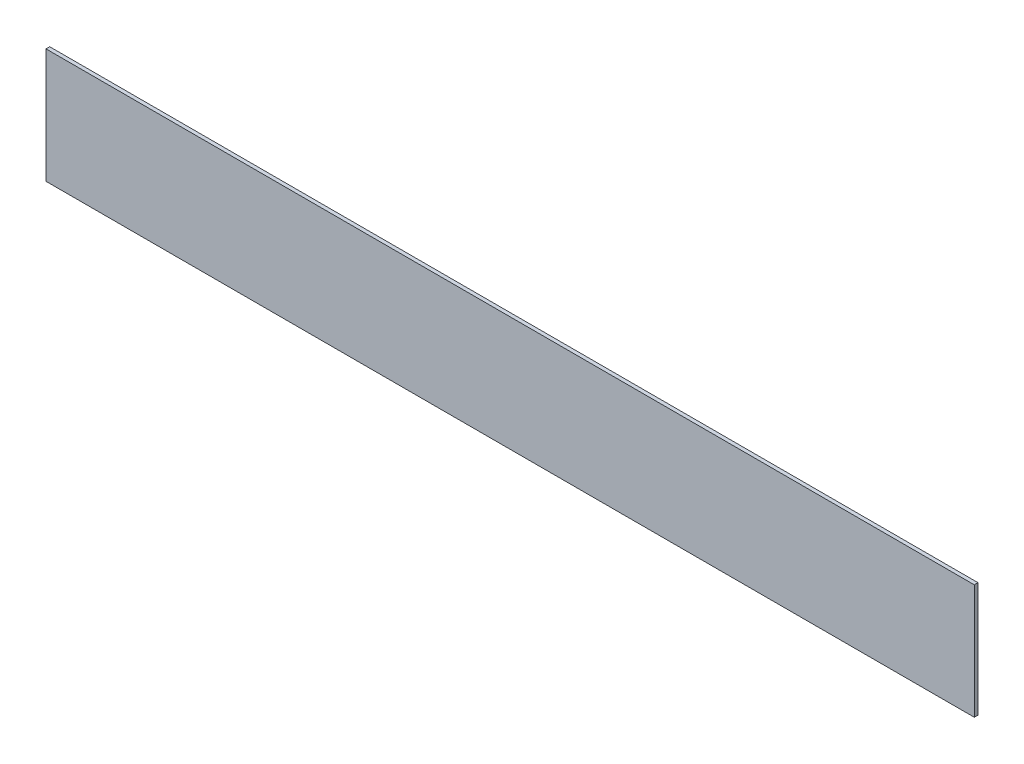
ISO-10303-21;
HEADER;
FILE_DESCRIPTION(('STEP AP214'),'2;1');
FILE_NAME('part.step','',(''),(''),'','','');
FILE_SCHEMA(('AUTOMOTIVE_DESIGN { 1 0 10303 214 1 1 1 1 }'));
ENDSEC;
DATA;
#1=APPLICATION_CONTEXT('core data for automotive mechanical design processes');
#2=APPLICATION_PROTOCOL_DEFINITION('international standard','automotive_design',2000,#1);
#3=PRODUCT_CONTEXT('',#1,'mechanical');
#4=PRODUCT('Part','Part','',(#3));
#5=PRODUCT_RELATED_PRODUCT_CATEGORY('part','',(#4));
#6=PRODUCT_DEFINITION_FORMATION('','',#4);
#7=PRODUCT_DEFINITION_CONTEXT('part definition',#1,'design');
#8=PRODUCT_DEFINITION('design','',#6,#7);
#9=PRODUCT_DEFINITION_SHAPE('','',#8);
#10=(LENGTH_UNIT() NAMED_UNIT(*) SI_UNIT(.MILLI.,.METRE.));
#11=(NAMED_UNIT(*) PLANE_ANGLE_UNIT() SI_UNIT($,.RADIAN.));
#12=(NAMED_UNIT(*) SI_UNIT($,.STERADIAN.) SOLID_ANGLE_UNIT());
#13=UNCERTAINTY_MEASURE_WITH_UNIT(LENGTH_MEASURE(1.E-05),#10,'distance_accuracy_value','');
#14=(GEOMETRIC_REPRESENTATION_CONTEXT(3) GLOBAL_UNCERTAINTY_ASSIGNED_CONTEXT((#13)) GLOBAL_UNIT_ASSIGNED_CONTEXT((#10,
#11,#12)) REPRESENTATION_CONTEXT('',''));
#15=CARTESIAN_POINT('',(0.,0.,0.));
#16=DIRECTION('',(0.,0.,1.));
#17=DIRECTION('',(1.,0.,0.));
#18=AXIS2_PLACEMENT_3D('',#15,#16,#17);
#19=CARTESIAN_POINT('',(2500.,309.,10.));
#20=DIRECTION('',(0.,-1.,0.));
#21=DIRECTION('',(1.,0.,0.));
#22=AXIS2_PLACEMENT_3D('',#19,#20,#21);
#23=PLANE('',#22);
#24=DIRECTION('',(-1.,0.,0.));
#25=VECTOR('',#24,1.);
#26=CARTESIAN_POINT('',(2500.,309.,0.));
#27=LINE('',#26,#25);
#28=CARTESIAN_POINT('',(2500.,309.,0.));
#29=VERTEX_POINT('',#28);
#30=CARTESIAN_POINT('',(0.,309.,0.));
#31=VERTEX_POINT('',#30);
#32=EDGE_CURVE('E107',#29,#31,#27,.T.);
#33=ORIENTED_EDGE('',*,*,#32,.T.);
#34=DIRECTION('',(0.,0.,-1.));
#35=VECTOR('',#34,1.);
#36=CARTESIAN_POINT('',(0.,309.,10.));
#37=LINE('',#36,#35);
#38=CARTESIAN_POINT('',(0.,309.,10.));
#39=VERTEX_POINT('',#38);
#40=EDGE_CURVE('E11',#39,#31,#37,.T.);
#41=ORIENTED_EDGE('',*,*,#40,.F.);
#42=DIRECTION('',(-1.,0.,0.));
#43=VECTOR('',#42,1.);
#44=CARTESIAN_POINT('',(2500.,309.,10.));
#45=LINE('',#44,#43);
#46=CARTESIAN_POINT('',(2500.,309.,10.));
#47=VERTEX_POINT('',#46);
#48=EDGE_CURVE('E91',#47,#39,#45,.T.);
#49=ORIENTED_EDGE('',*,*,#48,.F.);
#50=DIRECTION('',(0.,0.,-1.));
#51=VECTOR('',#50,1.);
#52=CARTESIAN_POINT('',(2500.,309.,10.));
#53=LINE('',#52,#51);
#54=EDGE_CURVE('E103',#47,#29,#53,.T.);
#55=ORIENTED_EDGE('',*,*,#54,.T.);
#56=EDGE_LOOP('',(#33,#41,#49,#55));
#57=FACE_BOUND('',#56,.T.);
#58=ADVANCED_FACE('F39',(#57),#23,.F.);
#59=CARTESIAN_POINT('',(0.,309.,10.));
#60=DIRECTION('',(1.,0.,0.));
#61=DIRECTION('',(0.,1.,0.));
#62=AXIS2_PLACEMENT_3D('',#59,#60,#61);
#63=PLANE('',#62);
#64=DIRECTION('',(0.,-1.,0.));
#65=VECTOR('',#64,1.);
#66=CARTESIAN_POINT('',(0.,309.,0.));
#67=LINE('',#66,#65);
#68=CARTESIAN_POINT('',(0.,0.,0.));
#69=VERTEX_POINT('',#68);
#70=EDGE_CURVE('E96',#31,#69,#67,.T.);
#71=ORIENTED_EDGE('',*,*,#70,.T.);
#72=DIRECTION('',(0.,0.,-1.));
#73=VECTOR('',#72,1.);
#74=CARTESIAN_POINT('',(0.,0.,10.));
#75=LINE('',#74,#73);
#76=CARTESIAN_POINT('',(0.,0.,10.));
#77=VERTEX_POINT('',#76);
#78=EDGE_CURVE('E48',#77,#69,#75,.T.);
#79=ORIENTED_EDGE('',*,*,#78,.F.);
#80=DIRECTION('',(0.,-1.,0.));
#81=VECTOR('',#80,1.);
#82=CARTESIAN_POINT('',(0.,309.,10.));
#83=LINE('',#82,#81);
#84=EDGE_CURVE('E86',#39,#77,#83,.T.);
#85=ORIENTED_EDGE('',*,*,#84,.F.);
#86=ORIENTED_EDGE('',*,*,#40,.T.);
#87=EDGE_LOOP('',(#71,#79,#85,#86));
#88=FACE_BOUND('',#87,.T.);
#89=ADVANCED_FACE('F95',(#88),#63,.F.);
#90=CARTESIAN_POINT('',(2500.,4.59242549680257E-13,10.));
#91=DIRECTION('',(0.,1.,0.));
#92=DIRECTION('',(-1.,0.,0.));
#93=AXIS2_PLACEMENT_3D('',#90,#91,#92);
#94=PLANE('',#93);
#95=DIRECTION('',(1.,0.,0.));
#96=VECTOR('',#95,1.);
#97=CARTESIAN_POINT('',(2500.,4.59242549680257E-13,0.));
#98=LINE('',#97,#96);
#99=CARTESIAN_POINT('',(2500.,4.59242549680257E-13,0.));
#100=VERTEX_POINT('',#99);
#101=EDGE_CURVE('E73',#69,#100,#98,.T.);
#102=ORIENTED_EDGE('',*,*,#101,.T.);
#103=DIRECTION('',(0.,0.,-1.));
#104=VECTOR('',#103,1.);
#105=CARTESIAN_POINT('',(2500.,4.59242549680257E-13,10.));
#106=LINE('',#105,#104);
#107=CARTESIAN_POINT('',(2500.,4.59242549680257E-13,10.));
#108=VERTEX_POINT('',#107);
#109=EDGE_CURVE('E98',#108,#100,#106,.T.);
#110=ORIENTED_EDGE('',*,*,#109,.F.);
#111=DIRECTION('',(1.,0.,0.));
#112=VECTOR('',#111,1.);
#113=CARTESIAN_POINT('',(2500.,4.59242549680257E-13,10.));
#114=LINE('',#113,#112);
#115=EDGE_CURVE('E89',#77,#108,#114,.T.);
#116=ORIENTED_EDGE('',*,*,#115,.F.);
#117=ORIENTED_EDGE('',*,*,#78,.T.);
#118=EDGE_LOOP('',(#102,#110,#116,#117));
#119=FACE_BOUND('',#118,.T.);
#120=ADVANCED_FACE('F99',(#119),#94,.F.);
#121=CARTESIAN_POINT('',(2500.,309.,10.));
#122=DIRECTION('',(-1.,0.,0.));
#123=DIRECTION('',(0.,0.,1.));
#124=AXIS2_PLACEMENT_3D('',#121,#122,#123);
#125=PLANE('',#124);
#126=DIRECTION('',(0.,1.,0.));
#127=VECTOR('',#126,1.);
#128=CARTESIAN_POINT('',(2500.,309.,0.));
#129=LINE('',#128,#127);
#130=EDGE_CURVE('E79',#100,#29,#129,.T.);
#131=ORIENTED_EDGE('',*,*,#130,.T.);
#132=ORIENTED_EDGE('',*,*,#54,.F.);
#133=DIRECTION('',(0.,1.,0.));
#134=VECTOR('',#133,1.);
#135=CARTESIAN_POINT('',(2500.,309.,10.));
#136=LINE('',#135,#134);
#137=EDGE_CURVE('E56',#108,#47,#136,.T.);
#138=ORIENTED_EDGE('',*,*,#137,.F.);
#139=ORIENTED_EDGE('',*,*,#109,.T.);
#140=EDGE_LOOP('',(#131,#132,#138,#139));
#141=FACE_BOUND('',#140,.T.);
#142=ADVANCED_FACE('F120',(#141),#125,.F.);
#143=CARTESIAN_POINT('',(0.,0.,10.));
#144=DIRECTION('',(0.,0.,1.));
#145=DIRECTION('',(1.,0.,0.));
#146=AXIS2_PLACEMENT_3D('',#143,#144,#145);
#147=PLANE('',#146);
#148=ORIENTED_EDGE('',*,*,#48,.T.);
#149=ORIENTED_EDGE('',*,*,#84,.T.);
#150=ORIENTED_EDGE('',*,*,#115,.T.);
#151=ORIENTED_EDGE('',*,*,#137,.T.);
#152=EDGE_LOOP('',(#148,#149,#150,#151));
#153=FACE_BOUND('',#152,.T.);
#154=ADVANCED_FACE('F87',(#153),#147,.T.);
#155=CARTESIAN_POINT('',(0.,0.,0.));
#156=DIRECTION('',(0.,0.,1.));
#157=DIRECTION('',(1.,0.,0.));
#158=AXIS2_PLACEMENT_3D('',#155,#156,#157);
#159=PLANE('',#158);
#160=ORIENTED_EDGE('',*,*,#32,.F.);
#161=ORIENTED_EDGE('',*,*,#130,.F.);
#162=ORIENTED_EDGE('',*,*,#101,.F.);
#163=ORIENTED_EDGE('',*,*,#70,.F.);
#164=EDGE_LOOP('',(#160,#161,#162,#163));
#165=FACE_BOUND('',#164,.T.);
#166=ADVANCED_FACE('F123',(#165),#159,.F.);
#167=CLOSED_SHELL('',(#58,#89,#120,#142,#154,#166));
#168=MANIFOLD_SOLID_BREP('B2',#167);
#169=ADVANCED_BREP_SHAPE_REPRESENTATION('',(#18,#168),#14);
#170=SHAPE_DEFINITION_REPRESENTATION(#9,#169);
ENDSEC;
END-ISO-10303-21;
